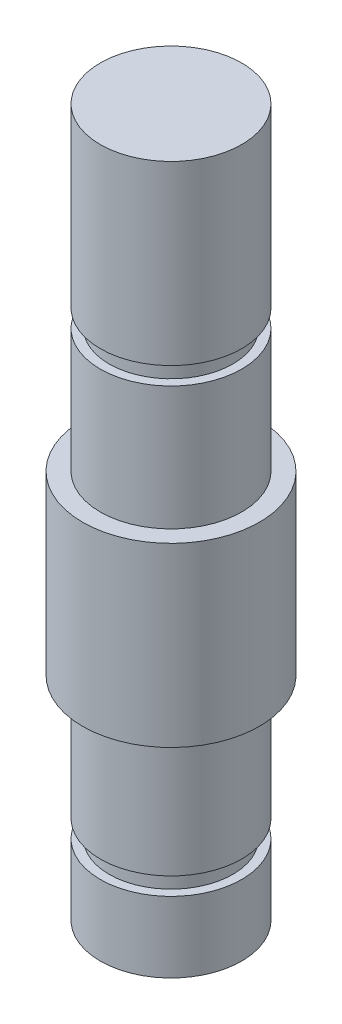
ISO-10303-21;
HEADER;
FILE_DESCRIPTION(('STEP AP214'),'2;1');
FILE_NAME('part.step','',(''),(''),'','','');
FILE_SCHEMA(('AUTOMOTIVE_DESIGN { 1 0 10303 214 1 1 1 1 }'));
ENDSEC;
DATA;
#1=APPLICATION_CONTEXT('core data for automotive mechanical design processes');
#2=APPLICATION_PROTOCOL_DEFINITION('international standard','automotive_design',2000,#1);
#3=PRODUCT_CONTEXT('',#1,'mechanical');
#4=PRODUCT('Part','Part','',(#3));
#5=PRODUCT_RELATED_PRODUCT_CATEGORY('part','',(#4));
#6=PRODUCT_DEFINITION_FORMATION('','',#4);
#7=PRODUCT_DEFINITION_CONTEXT('part definition',#1,'design');
#8=PRODUCT_DEFINITION('design','',#6,#7);
#9=PRODUCT_DEFINITION_SHAPE('','',#8);
#10=(LENGTH_UNIT() NAMED_UNIT(*) SI_UNIT(.MILLI.,.METRE.));
#11=(NAMED_UNIT(*) PLANE_ANGLE_UNIT() SI_UNIT($,.RADIAN.));
#12=(NAMED_UNIT(*) SI_UNIT($,.STERADIAN.) SOLID_ANGLE_UNIT());
#13=UNCERTAINTY_MEASURE_WITH_UNIT(LENGTH_MEASURE(1.E-05),#10,'distance_accuracy_value','');
#14=(GEOMETRIC_REPRESENTATION_CONTEXT(3) GLOBAL_UNCERTAINTY_ASSIGNED_CONTEXT((#13)) GLOBAL_UNIT_ASSIGNED_CONTEXT((#10,
#11,#12)) REPRESENTATION_CONTEXT('',''));
#15=CARTESIAN_POINT('',(0.,0.,0.));
#16=DIRECTION('',(0.,0.,1.));
#17=DIRECTION('',(1.,0.,0.));
#18=AXIS2_PLACEMENT_3D('',#15,#16,#17);
#19=CARTESIAN_POINT('',(0.,-5.,0.));
#20=DIRECTION('',(0.,-1.,0.));
#21=DIRECTION('',(0.,0.,-1.));
#22=AXIS2_PLACEMENT_3D('',#19,#20,#21);
#23=CYLINDRICAL_SURFACE('',#22,4.);
#24=CARTESIAN_POINT('',(0.,-5.,0.));
#25=DIRECTION('',(0.,1.,0.));
#26=DIRECTION('',(0.,0.,1.));
#27=AXIS2_PLACEMENT_3D('',#24,#25,#26);
#28=CIRCLE('',#27,4.);
#29=CARTESIAN_POINT('',(0.,-5.,4.));
#30=VERTEX_POINT('',#29);
#31=EDGE_CURVE('E50',#30,#30,#28,.T.);
#32=ORIENTED_EDGE('',*,*,#31,.F.);
#33=EDGE_LOOP('',(#32));
#34=FACE_BOUND('',#33,.T.);
#35=CARTESIAN_POINT('',(0.,-12.,0.));
#36=DIRECTION('',(0.,1.,0.));
#37=DIRECTION('',(0.,0.,1.));
#38=AXIS2_PLACEMENT_3D('',#35,#36,#37);
#39=CIRCLE('',#38,4.);
#40=CARTESIAN_POINT('',(0.,-12.,4.));
#41=VERTEX_POINT('',#40);
#42=EDGE_CURVE('E68',#41,#41,#39,.T.);
#43=ORIENTED_EDGE('',*,*,#42,.T.);
#44=EDGE_LOOP('',(#43));
#45=FACE_BOUND('',#44,.T.);
#46=ADVANCED_FACE('F35',(#34,#45),#23,.T.);
#47=CARTESIAN_POINT('',(0.,5.,0.));
#48=DIRECTION('',(0.,1.,0.));
#49=DIRECTION('',(0.,0.,1.));
#50=AXIS2_PLACEMENT_3D('',#47,#48,#49);
#51=CYLINDRICAL_SURFACE('',#50,4.);
#52=CARTESIAN_POINT('',(0.,5.,0.));
#53=DIRECTION('',(0.,1.,0.));
#54=DIRECTION('',(0.,0.,1.));
#55=AXIS2_PLACEMENT_3D('',#52,#53,#54);
#56=CIRCLE('',#55,4.);
#57=CARTESIAN_POINT('',(0.,5.,4.));
#58=VERTEX_POINT('',#57);
#59=EDGE_CURVE('E42',#58,#58,#56,.T.);
#60=ORIENTED_EDGE('',*,*,#59,.T.);
#61=EDGE_LOOP('',(#60));
#62=FACE_BOUND('',#61,.T.);
#63=CARTESIAN_POINT('',(0.,12.,0.));
#64=DIRECTION('',(0.,1.,0.));
#65=DIRECTION('',(0.,0.,1.));
#66=AXIS2_PLACEMENT_3D('',#63,#64,#65);
#67=CIRCLE('',#66,4.);
#68=CARTESIAN_POINT('',(0.,12.,4.));
#69=VERTEX_POINT('',#68);
#70=EDGE_CURVE('E56',#69,#69,#67,.T.);
#71=ORIENTED_EDGE('',*,*,#70,.F.);
#72=EDGE_LOOP('',(#71));
#73=FACE_BOUND('',#72,.T.);
#74=ADVANCED_FACE('F94',(#62,#73),#51,.T.);
#75=CARTESIAN_POINT('',(0.,17.,0.));
#76=DIRECTION('',(0.,-1.,0.));
#77=DIRECTION('',(0.,0.,-1.));
#78=AXIS2_PLACEMENT_3D('',#75,#76,#77);
#79=CYLINDRICAL_SURFACE('',#78,5.);
#80=CARTESIAN_POINT('',(0.,5.,0.));
#81=DIRECTION('',(0.,1.,0.));
#82=DIRECTION('',(0.,0.,1.));
#83=AXIS2_PLACEMENT_3D('',#80,#81,#82);
#84=CIRCLE('',#83,5.);
#85=CARTESIAN_POINT('',(0.,5.,5.));
#86=VERTEX_POINT('',#85);
#87=EDGE_CURVE('E10',#86,#86,#84,.T.);
#88=ORIENTED_EDGE('',*,*,#87,.F.);
#89=EDGE_LOOP('',(#88));
#90=FACE_BOUND('',#89,.T.);
#91=CARTESIAN_POINT('',(0.,-5.,0.));
#92=DIRECTION('',(0.,1.,0.));
#93=DIRECTION('',(0.,0.,1.));
#94=AXIS2_PLACEMENT_3D('',#91,#92,#93);
#95=CIRCLE('',#94,5.);
#96=CARTESIAN_POINT('',(0.,-5.,5.));
#97=VERTEX_POINT('',#96);
#98=EDGE_CURVE('E46',#97,#97,#95,.T.);
#99=ORIENTED_EDGE('',*,*,#98,.T.);
#100=EDGE_LOOP('',(#99));
#101=FACE_BOUND('',#100,.T.);
#102=ADVANCED_FACE('F37',(#90,#101),#79,.T.);
#103=CARTESIAN_POINT('',(0.,5.,0.));
#104=DIRECTION('',(0.,1.,0.));
#105=DIRECTION('',(0.,0.,1.));
#106=AXIS2_PLACEMENT_3D('',#103,#104,#105);
#107=PLANE('',#106);
#108=ORIENTED_EDGE('',*,*,#59,.F.);
#109=EDGE_LOOP('',(#108));
#110=FACE_BOUND('',#109,.T.);
#111=ORIENTED_EDGE('',*,*,#87,.T.);
#112=EDGE_LOOP('',(#111));
#113=FACE_BOUND('',#112,.T.);
#114=ADVANCED_FACE('F234',(#110,#113),#107,.T.);
#115=CARTESIAN_POINT('',(0.,-5.,0.));
#116=DIRECTION('',(0.,-1.,0.));
#117=DIRECTION('',(0.,0.,1.));
#118=AXIS2_PLACEMENT_3D('',#115,#116,#117);
#119=PLANE('',#118);
#120=ORIENTED_EDGE('',*,*,#98,.F.);
#121=EDGE_LOOP('',(#120));
#122=FACE_BOUND('',#121,.T.);
#123=ORIENTED_EDGE('',*,*,#31,.T.);
#124=EDGE_LOOP('',(#123));
#125=FACE_BOUND('',#124,.T.);
#126=ADVANCED_FACE('F145',(#122,#125),#119,.T.);
#127=CARTESIAN_POINT('',(0.,12.,0.));
#128=DIRECTION('',(0.,1.,0.));
#129=DIRECTION('',(0.,0.,1.));
#130=AXIS2_PLACEMENT_3D('',#127,#128,#129);
#131=PLANE('',#130);
#132=CARTESIAN_POINT('',(0.,12.,0.));
#133=DIRECTION('',(0.,1.,0.));
#134=DIRECTION('',(0.,0.,1.));
#135=AXIS2_PLACEMENT_3D('',#132,#133,#134);
#136=CIRCLE('',#135,3.5);
#137=CARTESIAN_POINT('',(0.,12.,3.5));
#138=VERTEX_POINT('',#137);
#139=EDGE_CURVE('E62',#138,#138,#136,.T.);
#140=ORIENTED_EDGE('',*,*,#139,.F.);
#141=EDGE_LOOP('',(#140));
#142=FACE_BOUND('',#141,.T.);
#143=ORIENTED_EDGE('',*,*,#70,.T.);
#144=EDGE_LOOP('',(#143));
#145=FACE_BOUND('',#144,.T.);
#146=ADVANCED_FACE('F143',(#142,#145),#131,.T.);
#147=CARTESIAN_POINT('',(0.,13.,0.));
#148=DIRECTION('',(0.,1.,0.));
#149=DIRECTION('',(0.,0.,1.));
#150=AXIS2_PLACEMENT_3D('',#147,#148,#149);
#151=PLANE('',#150);
#152=CARTESIAN_POINT('',(0.,13.,0.));
#153=DIRECTION('',(0.,1.,0.));
#154=DIRECTION('',(0.,0.,1.));
#155=AXIS2_PLACEMENT_3D('',#152,#153,#154);
#156=CIRCLE('',#155,3.5);
#157=CARTESIAN_POINT('',(0.,13.,3.5));
#158=VERTEX_POINT('',#157);
#159=EDGE_CURVE('E65',#158,#158,#156,.T.);
#160=ORIENTED_EDGE('',*,*,#159,.T.);
#161=EDGE_LOOP('',(#160));
#162=FACE_BOUND('',#161,.T.);
#163=CARTESIAN_POINT('',(0.,13.,0.));
#164=DIRECTION('',(0.,1.,0.));
#165=DIRECTION('',(0.,0.,1.));
#166=AXIS2_PLACEMENT_3D('',#163,#164,#165);
#167=CIRCLE('',#166,4.);
#168=CARTESIAN_POINT('',(0.,13.,4.));
#169=VERTEX_POINT('',#168);
#170=EDGE_CURVE('E59',#169,#169,#167,.T.);
#171=ORIENTED_EDGE('',*,*,#170,.F.);
#172=EDGE_LOOP('',(#171));
#173=FACE_BOUND('',#172,.T.);
#174=ADVANCED_FACE('F102',(#162,#173),#151,.F.);
#175=CARTESIAN_POINT('',(0.,12.,0.));
#176=DIRECTION('',(0.,1.,0.));
#177=DIRECTION('',(0.,0.,1.));
#178=AXIS2_PLACEMENT_3D('',#175,#176,#177);
#179=CYLINDRICAL_SURFACE('',#178,3.5);
#180=ORIENTED_EDGE('',*,*,#139,.T.);
#181=EDGE_LOOP('',(#180));
#182=FACE_BOUND('',#181,.T.);
#183=ORIENTED_EDGE('',*,*,#159,.F.);
#184=EDGE_LOOP('',(#183));
#185=FACE_BOUND('',#184,.T.);
#186=ADVANCED_FACE('F91',(#182,#185),#179,.T.);
#187=ORIENTED_EDGE('',*,*,#170,.T.);
#188=EDGE_LOOP('',(#187));
#189=FACE_BOUND('',#188,.T.);
#190=CARTESIAN_POINT('',(0.,23.,0.));
#191=DIRECTION('',(0.,1.,0.));
#192=DIRECTION('',(0.,0.,1.));
#193=AXIS2_PLACEMENT_3D('',#190,#191,#192);
#194=CIRCLE('',#193,4.);
#195=CARTESIAN_POINT('',(0.,23.,4.));
#196=VERTEX_POINT('',#195);
#197=EDGE_CURVE('E80',#196,#196,#194,.T.);
#198=ORIENTED_EDGE('',*,*,#197,.F.);
#199=EDGE_LOOP('',(#198));
#200=FACE_BOUND('',#199,.T.);
#201=ADVANCED_FACE('F88',(#189,#200),#51,.T.);
#202=CARTESIAN_POINT('',(0.,-12.,0.));
#203=DIRECTION('',(0.,-1.,0.));
#204=DIRECTION('',(0.,0.,1.));
#205=AXIS2_PLACEMENT_3D('',#202,#203,#204);
#206=PLANE('',#205);
#207=ORIENTED_EDGE('',*,*,#42,.F.);
#208=EDGE_LOOP('',(#207));
#209=FACE_BOUND('',#208,.T.);
#210=CARTESIAN_POINT('',(0.,-12.,0.));
#211=DIRECTION('',(0.,1.,0.));
#212=DIRECTION('',(0.,0.,1.));
#213=AXIS2_PLACEMENT_3D('',#210,#211,#212);
#214=CIRCLE('',#213,3.5);
#215=CARTESIAN_POINT('',(0.,-12.,3.5));
#216=VERTEX_POINT('',#215);
#217=EDGE_CURVE('E74',#216,#216,#214,.T.);
#218=ORIENTED_EDGE('',*,*,#217,.T.);
#219=EDGE_LOOP('',(#218));
#220=FACE_BOUND('',#219,.T.);
#221=ADVANCED_FACE('F90',(#209,#220),#206,.T.);
#222=CARTESIAN_POINT('',(0.,-13.,0.));
#223=DIRECTION('',(0.,-1.,0.));
#224=DIRECTION('',(0.,0.,1.));
#225=AXIS2_PLACEMENT_3D('',#222,#223,#224);
#226=PLANE('',#225);
#227=CARTESIAN_POINT('',(0.,-13.,0.));
#228=DIRECTION('',(0.,1.,0.));
#229=DIRECTION('',(0.,0.,1.));
#230=AXIS2_PLACEMENT_3D('',#227,#228,#229);
#231=CIRCLE('',#230,4.);
#232=CARTESIAN_POINT('',(0.,-13.,4.));
#233=VERTEX_POINT('',#232);
#234=EDGE_CURVE('E71',#233,#233,#231,.T.);
#235=ORIENTED_EDGE('',*,*,#234,.T.);
#236=EDGE_LOOP('',(#235));
#237=FACE_BOUND('',#236,.T.);
#238=CARTESIAN_POINT('',(0.,-13.,0.));
#239=DIRECTION('',(0.,1.,0.));
#240=DIRECTION('',(0.,0.,1.));
#241=AXIS2_PLACEMENT_3D('',#238,#239,#240);
#242=CIRCLE('',#241,3.5);
#243=CARTESIAN_POINT('',(0.,-13.,3.5));
#244=VERTEX_POINT('',#243);
#245=EDGE_CURVE('E77',#244,#244,#242,.T.);
#246=ORIENTED_EDGE('',*,*,#245,.F.);
#247=EDGE_LOOP('',(#246));
#248=FACE_BOUND('',#247,.T.);
#249=ADVANCED_FACE('F99',(#237,#248),#226,.F.);
#250=CARTESIAN_POINT('',(0.,-12.,0.));
#251=DIRECTION('',(0.,-1.,0.));
#252=DIRECTION('',(0.,0.,-1.));
#253=AXIS2_PLACEMENT_3D('',#250,#251,#252);
#254=CYLINDRICAL_SURFACE('',#253,3.5);
#255=ORIENTED_EDGE('',*,*,#217,.F.);
#256=EDGE_LOOP('',(#255));
#257=FACE_BOUND('',#256,.T.);
#258=ORIENTED_EDGE('',*,*,#245,.T.);
#259=EDGE_LOOP('',(#258));
#260=FACE_BOUND('',#259,.T.);
#261=ADVANCED_FACE('F125',(#257,#260),#254,.T.);
#262=CARTESIAN_POINT('',(0.,-17.,0.));
#263=DIRECTION('',(0.,1.,0.));
#264=DIRECTION('',(0.,0.,1.));
#265=AXIS2_PLACEMENT_3D('',#262,#263,#264);
#266=PLANE('',#265);
#267=CARTESIAN_POINT('',(0.,-17.,0.));
#268=DIRECTION('',(0.,1.,0.));
#269=DIRECTION('',(0.,0.,1.));
#270=AXIS2_PLACEMENT_3D('',#267,#268,#269);
#271=CIRCLE('',#270,4.);
#272=CARTESIAN_POINT('',(0.,-17.,4.));
#273=VERTEX_POINT('',#272);
#274=EDGE_CURVE('E53',#273,#273,#271,.T.);
#275=ORIENTED_EDGE('',*,*,#274,.F.);
#276=EDGE_LOOP('',(#275));
#277=FACE_BOUND('',#276,.T.);
#278=ADVANCED_FACE('F118',(#277),#266,.F.);
#279=ORIENTED_EDGE('',*,*,#234,.F.);
#280=EDGE_LOOP('',(#279));
#281=FACE_BOUND('',#280,.T.);
#282=ORIENTED_EDGE('',*,*,#274,.T.);
#283=EDGE_LOOP('',(#282));
#284=FACE_BOUND('',#283,.T.);
#285=ADVANCED_FACE('F111',(#281,#284),#23,.T.);
#286=CARTESIAN_POINT('',(0.,23.,0.));
#287=DIRECTION('',(0.,1.,0.));
#288=DIRECTION('',(0.,0.,1.));
#289=AXIS2_PLACEMENT_3D('',#286,#287,#288);
#290=PLANE('',#289);
#291=ORIENTED_EDGE('',*,*,#197,.T.);
#292=EDGE_LOOP('',(#291));
#293=FACE_BOUND('',#292,.T.);
#294=ADVANCED_FACE('F86',(#293),#290,.T.);
#295=CLOSED_SHELL('',(#46,#74,#102,#114,#126,#146,#174,#186,#201,#221,#249,#261,#278,#285,#294));
#296=MANIFOLD_SOLID_BREP('B2',#295);
#297=ADVANCED_BREP_SHAPE_REPRESENTATION('',(#18,#296),#14);
#298=SHAPE_DEFINITION_REPRESENTATION(#9,#297);
ENDSEC;
END-ISO-10303-21;
